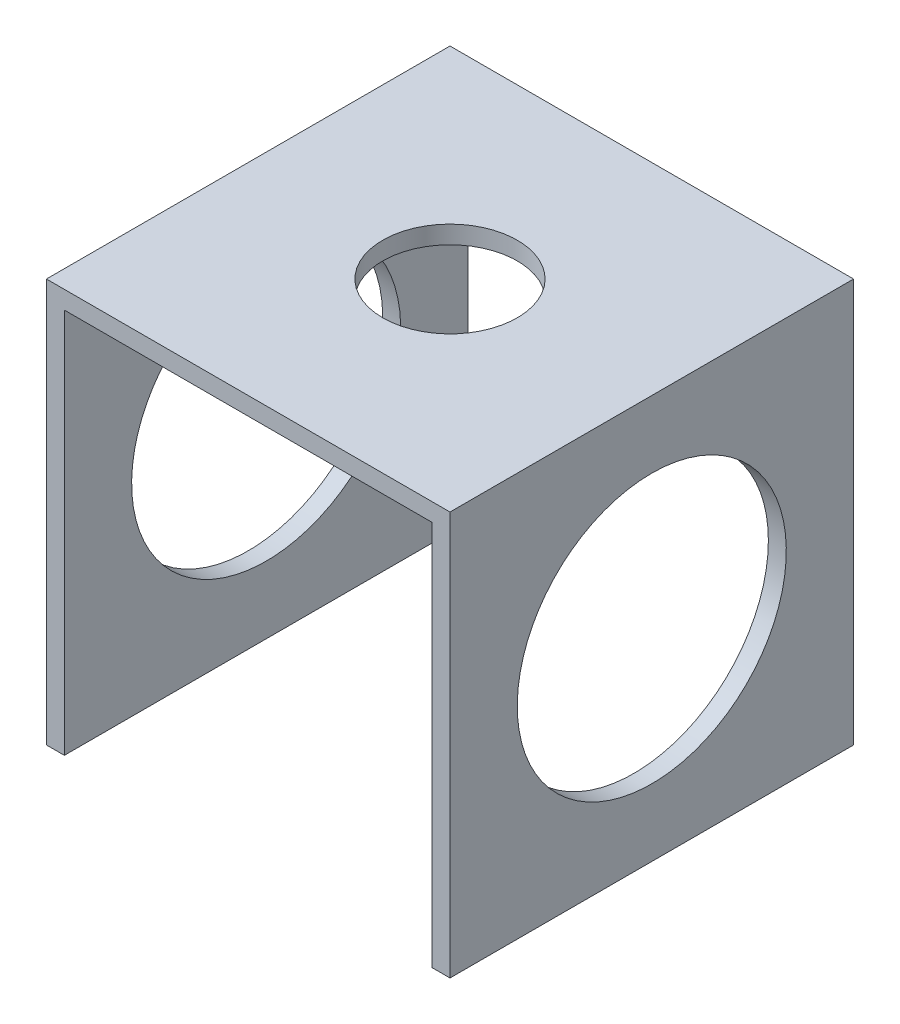
ISO-10303-21;
HEADER;
FILE_DESCRIPTION(('STEP AP214'),'2;1');
FILE_NAME('part.step','',(''),(''),'','','');
FILE_SCHEMA(('AUTOMOTIVE_DESIGN { 1 0 10303 214 1 1 1 1 }'));
ENDSEC;
DATA;
#1=APPLICATION_CONTEXT('core data for automotive mechanical design processes');
#2=APPLICATION_PROTOCOL_DEFINITION('international standard','automotive_design',2000,#1);
#3=PRODUCT_CONTEXT('',#1,'mechanical');
#4=PRODUCT('Part','Part','',(#3));
#5=PRODUCT_RELATED_PRODUCT_CATEGORY('part','',(#4));
#6=PRODUCT_DEFINITION_FORMATION('','',#4);
#7=PRODUCT_DEFINITION_CONTEXT('part definition',#1,'design');
#8=PRODUCT_DEFINITION('design','',#6,#7);
#9=PRODUCT_DEFINITION_SHAPE('','',#8);
#10=(LENGTH_UNIT() NAMED_UNIT(*) SI_UNIT(.MILLI.,.METRE.));
#11=(NAMED_UNIT(*) PLANE_ANGLE_UNIT() SI_UNIT($,.RADIAN.));
#12=(NAMED_UNIT(*) SI_UNIT($,.STERADIAN.) SOLID_ANGLE_UNIT());
#13=UNCERTAINTY_MEASURE_WITH_UNIT(LENGTH_MEASURE(1.E-05),#10,'distance_accuracy_value','');
#14=(GEOMETRIC_REPRESENTATION_CONTEXT(3) GLOBAL_UNCERTAINTY_ASSIGNED_CONTEXT((#13)) GLOBAL_UNIT_ASSIGNED_CONTEXT((#10,
#11,#12)) REPRESENTATION_CONTEXT('',''));
#15=CARTESIAN_POINT('',(0.,0.,0.));
#16=DIRECTION('',(0.,0.,1.));
#17=DIRECTION('',(1.,0.,0.));
#18=AXIS2_PLACEMENT_3D('',#15,#16,#17);
#19=CARTESIAN_POINT('',(90.,180.,180.));
#20=DIRECTION('',(-1.,0.,0.));
#21=DIRECTION('',(0.,-1.,0.));
#22=AXIS2_PLACEMENT_3D('',#19,#20,#21);
#23=PLANE('',#22);
#24=CARTESIAN_POINT('',(90.,90.,90.));
#25=DIRECTION('',(1.,0.,0.));
#26=DIRECTION('',(0.,1.,0.));
#27=AXIS2_PLACEMENT_3D('',#24,#25,#26);
#28=CIRCLE('',#27,60.);
#29=CARTESIAN_POINT('',(90.,150.,90.));
#30=VERTEX_POINT('',#29);
#31=EDGE_CURVE('E216',#30,#30,#28,.T.);
#32=ORIENTED_EDGE('',*,*,#31,.F.);
#33=EDGE_LOOP('',(#32));
#34=FACE_BOUND('',#33,.T.);
#35=DIRECTION('',(0.,1.,0.));
#36=VECTOR('',#35,1.);
#37=CARTESIAN_POINT('',(90.,180.,0.));
#38=LINE('',#37,#36);
#39=CARTESIAN_POINT('',(90.,0.,0.));
#40=VERTEX_POINT('',#39);
#41=CARTESIAN_POINT('',(90.,180.,0.));
#42=VERTEX_POINT('',#41);
#43=EDGE_CURVE('E133',#40,#42,#38,.T.);
#44=ORIENTED_EDGE('',*,*,#43,.T.);
#45=DIRECTION('',(0.,0.,-1.));
#46=VECTOR('',#45,1.);
#47=CARTESIAN_POINT('',(90.,180.,180.));
#48=LINE('',#47,#46);
#49=CARTESIAN_POINT('',(90.,180.,180.));
#50=VERTEX_POINT('',#49);
#51=EDGE_CURVE('E11',#50,#42,#48,.T.);
#52=ORIENTED_EDGE('',*,*,#51,.F.);
#53=DIRECTION('',(0.,1.,0.));
#54=VECTOR('',#53,1.);
#55=CARTESIAN_POINT('',(90.,180.,180.));
#56=LINE('',#55,#54);
#57=CARTESIAN_POINT('',(90.,0.,180.));
#58=VERTEX_POINT('',#57);
#59=EDGE_CURVE('E148',#58,#50,#56,.T.);
#60=ORIENTED_EDGE('',*,*,#59,.F.);
#61=DIRECTION('',(0.,0.,-1.));
#62=VECTOR('',#61,1.);
#63=CARTESIAN_POINT('',(90.,0.,180.));
#64=LINE('',#63,#62);
#65=EDGE_CURVE('E129',#58,#40,#64,.T.);
#66=ORIENTED_EDGE('',*,*,#65,.T.);
#67=EDGE_LOOP('',(#44,#52,#60,#66));
#68=FACE_BOUND('',#67,.T.);
#69=ADVANCED_FACE('F35',(#34,#68),#23,.F.);
#70=CARTESIAN_POINT('',(-90.,180.,180.));
#71=DIRECTION('',(0.,-1.,0.));
#72=DIRECTION('',(0.,0.,-1.));
#73=AXIS2_PLACEMENT_3D('',#70,#71,#72);
#74=PLANE('',#73);
#75=CARTESIAN_POINT('',(0.,180.,90.));
#76=DIRECTION('',(0.,1.,0.));
#77=DIRECTION('',(0.,0.,1.));
#78=AXIS2_PLACEMENT_3D('',#75,#76,#77);
#79=CIRCLE('',#78,30.);
#80=CARTESIAN_POINT('',(0.,180.,120.));
#81=VERTEX_POINT('',#80);
#82=EDGE_CURVE('E160',#81,#81,#79,.T.);
#83=ORIENTED_EDGE('',*,*,#82,.F.);
#84=EDGE_LOOP('',(#83));
#85=FACE_BOUND('',#84,.T.);
#86=DIRECTION('',(-1.,0.,0.));
#87=VECTOR('',#86,1.);
#88=CARTESIAN_POINT('',(-90.,180.,0.));
#89=LINE('',#88,#87);
#90=CARTESIAN_POINT('',(-90.,180.,0.));
#91=VERTEX_POINT('',#90);
#92=EDGE_CURVE('E136',#42,#91,#89,.T.);
#93=ORIENTED_EDGE('',*,*,#92,.T.);
#94=DIRECTION('',(0.,0.,-1.));
#95=VECTOR('',#94,1.);
#96=CARTESIAN_POINT('',(-90.,180.,180.));
#97=LINE('',#96,#95);
#98=CARTESIAN_POINT('',(-90.,180.,180.));
#99=VERTEX_POINT('',#98);
#100=EDGE_CURVE('E44',#99,#91,#97,.T.);
#101=ORIENTED_EDGE('',*,*,#100,.F.);
#102=DIRECTION('',(-1.,0.,0.));
#103=VECTOR('',#102,1.);
#104=CARTESIAN_POINT('',(-90.,180.,180.));
#105=LINE('',#104,#103);
#106=EDGE_CURVE('E96',#50,#99,#105,.T.);
#107=ORIENTED_EDGE('',*,*,#106,.F.);
#108=ORIENTED_EDGE('',*,*,#51,.T.);
#109=EDGE_LOOP('',(#93,#101,#107,#108));
#110=FACE_BOUND('',#109,.T.);
#111=ADVANCED_FACE('F207',(#85,#110),#74,.F.);
#112=CARTESIAN_POINT('',(-90.,180.,180.));
#113=DIRECTION('',(1.,0.,0.));
#114=DIRECTION('',(0.,1.,0.));
#115=AXIS2_PLACEMENT_3D('',#112,#113,#114);
#116=PLANE('',#115);
#117=CARTESIAN_POINT('',(-90.,90.,90.));
#118=DIRECTION('',(1.,0.,0.));
#119=DIRECTION('',(0.,1.,0.));
#120=AXIS2_PLACEMENT_3D('',#117,#118,#119);
#121=CIRCLE('',#120,60.);
#122=CARTESIAN_POINT('',(-90.,150.,90.));
#123=VERTEX_POINT('',#122);
#124=EDGE_CURVE('E164',#123,#123,#121,.T.);
#125=ORIENTED_EDGE('',*,*,#124,.T.);
#126=EDGE_LOOP('',(#125));
#127=FACE_BOUND('',#126,.T.);
#128=DIRECTION('',(0.,-1.,0.));
#129=VECTOR('',#128,1.);
#130=CARTESIAN_POINT('',(-90.,180.,0.));
#131=LINE('',#130,#129);
#132=CARTESIAN_POINT('',(-90.,0.,0.));
#133=VERTEX_POINT('',#132);
#134=EDGE_CURVE('E139',#91,#133,#131,.T.);
#135=ORIENTED_EDGE('',*,*,#134,.T.);
#136=DIRECTION('',(0.,0.,-1.));
#137=VECTOR('',#136,1.);
#138=CARTESIAN_POINT('',(-90.,0.,180.));
#139=LINE('',#138,#137);
#140=CARTESIAN_POINT('',(-90.,0.,180.));
#141=VERTEX_POINT('',#140);
#142=EDGE_CURVE('E155',#141,#133,#139,.T.);
#143=ORIENTED_EDGE('',*,*,#142,.F.);
#144=DIRECTION('',(0.,-1.,0.));
#145=VECTOR('',#144,1.);
#146=CARTESIAN_POINT('',(-90.,180.,180.));
#147=LINE('',#146,#145);
#148=EDGE_CURVE('E175',#99,#141,#147,.T.);
#149=ORIENTED_EDGE('',*,*,#148,.F.);
#150=ORIENTED_EDGE('',*,*,#100,.T.);
#151=EDGE_LOOP('',(#135,#143,#149,#150));
#152=FACE_BOUND('',#151,.T.);
#153=ADVANCED_FACE('F212',(#127,#152),#116,.F.);
#154=CARTESIAN_POINT('',(-90.,0.,180.));
#155=DIRECTION('',(0.,1.,0.));
#156=DIRECTION('',(-1.,0.,0.));
#157=AXIS2_PLACEMENT_3D('',#154,#155,#156);
#158=PLANE('',#157);
#159=DIRECTION('',(1.,0.,0.));
#160=VECTOR('',#159,1.);
#161=CARTESIAN_POINT('',(-90.,0.,0.));
#162=LINE('',#161,#160);
#163=CARTESIAN_POINT('',(-82.,0.,0.));
#164=VERTEX_POINT('',#163);
#165=EDGE_CURVE('E141',#133,#164,#162,.T.);
#166=ORIENTED_EDGE('',*,*,#165,.T.);
#167=DIRECTION('',(0.,0.,-1.));
#168=VECTOR('',#167,1.);
#169=CARTESIAN_POINT('',(-82.,0.,180.));
#170=LINE('',#169,#168);
#171=CARTESIAN_POINT('',(-82.,0.,180.));
#172=VERTEX_POINT('',#171);
#173=EDGE_CURVE('E152',#172,#164,#170,.T.);
#174=ORIENTED_EDGE('',*,*,#173,.F.);
#175=DIRECTION('',(1.,0.,0.));
#176=VECTOR('',#175,1.);
#177=CARTESIAN_POINT('',(-90.,0.,180.));
#178=LINE('',#177,#176);
#179=EDGE_CURVE('E177',#141,#172,#178,.T.);
#180=ORIENTED_EDGE('',*,*,#179,.F.);
#181=ORIENTED_EDGE('',*,*,#142,.T.);
#182=EDGE_LOOP('',(#166,#174,#180,#181));
#183=FACE_BOUND('',#182,.T.);
#184=ADVANCED_FACE('F183',(#183),#158,.F.);
#185=CARTESIAN_POINT('',(-82.,0.,180.));
#186=DIRECTION('',(-1.,0.,0.));
#187=DIRECTION('',(0.,0.,1.));
#188=AXIS2_PLACEMENT_3D('',#185,#186,#187);
#189=PLANE('',#188);
#190=CARTESIAN_POINT('',(-82.,90.,90.));
#191=DIRECTION('',(-1.,0.,0.));
#192=DIRECTION('',(0.,0.,1.));
#193=AXIS2_PLACEMENT_3D('',#190,#191,#192);
#194=CIRCLE('',#193,60.);
#195=CARTESIAN_POINT('',(-82.,150.,90.));
#196=VERTEX_POINT('',#195);
#197=EDGE_CURVE('E169',#196,#196,#194,.T.);
#198=ORIENTED_EDGE('',*,*,#197,.T.);
#199=EDGE_LOOP('',(#198));
#200=FACE_BOUND('',#199,.T.);
#201=DIRECTION('',(0.,1.,0.));
#202=VECTOR('',#201,1.);
#203=CARTESIAN_POINT('',(-82.,0.,0.));
#204=LINE('',#203,#202);
#205=CARTESIAN_POINT('',(-82.,172.,0.));
#206=VERTEX_POINT('',#205);
#207=EDGE_CURVE('E143',#164,#206,#204,.T.);
#208=ORIENTED_EDGE('',*,*,#207,.T.);
#209=DIRECTION('',(0.,0.,-1.));
#210=VECTOR('',#209,1.);
#211=CARTESIAN_POINT('',(-82.,172.,180.));
#212=LINE('',#211,#210);
#213=CARTESIAN_POINT('',(-82.,172.,180.));
#214=VERTEX_POINT('',#213);
#215=EDGE_CURVE('E124',#214,#206,#212,.T.);
#216=ORIENTED_EDGE('',*,*,#215,.F.);
#217=DIRECTION('',(0.,1.,0.));
#218=VECTOR('',#217,1.);
#219=CARTESIAN_POINT('',(-82.,0.,180.));
#220=LINE('',#219,#218);
#221=EDGE_CURVE('E115',#172,#214,#220,.T.);
#222=ORIENTED_EDGE('',*,*,#221,.F.);
#223=ORIENTED_EDGE('',*,*,#173,.T.);
#224=EDGE_LOOP('',(#208,#216,#222,#223));
#225=FACE_BOUND('',#224,.T.);
#226=ADVANCED_FACE('F187',(#200,#225),#189,.F.);
#227=CARTESIAN_POINT('',(82.,172.,180.));
#228=DIRECTION('',(0.,1.,0.));
#229=DIRECTION('',(0.,0.,1.));
#230=AXIS2_PLACEMENT_3D('',#227,#228,#229);
#231=PLANE('',#230);
#232=CARTESIAN_POINT('',(0.,172.,90.));
#233=DIRECTION('',(0.,1.,0.));
#234=DIRECTION('',(0.,0.,1.));
#235=AXIS2_PLACEMENT_3D('',#232,#233,#234);
#236=CIRCLE('',#235,30.);
#237=CARTESIAN_POINT('',(0.,172.,120.));
#238=VERTEX_POINT('',#237);
#239=EDGE_CURVE('E137',#238,#238,#236,.T.);
#240=ORIENTED_EDGE('',*,*,#239,.T.);
#241=EDGE_LOOP('',(#240));
#242=FACE_BOUND('',#241,.T.);
#243=DIRECTION('',(1.,0.,0.));
#244=VECTOR('',#243,1.);
#245=CARTESIAN_POINT('',(82.,172.,0.));
#246=LINE('',#245,#244);
#247=CARTESIAN_POINT('',(82.,172.,0.));
#248=VERTEX_POINT('',#247);
#249=EDGE_CURVE('E123',#206,#248,#246,.T.);
#250=ORIENTED_EDGE('',*,*,#249,.T.);
#251=DIRECTION('',(0.,0.,-1.));
#252=VECTOR('',#251,1.);
#253=CARTESIAN_POINT('',(82.,172.,180.));
#254=LINE('',#253,#252);
#255=CARTESIAN_POINT('',(82.,172.,180.));
#256=VERTEX_POINT('',#255);
#257=EDGE_CURVE('E120',#256,#248,#254,.T.);
#258=ORIENTED_EDGE('',*,*,#257,.F.);
#259=DIRECTION('',(1.,0.,0.));
#260=VECTOR('',#259,1.);
#261=CARTESIAN_POINT('',(82.,172.,180.));
#262=LINE('',#261,#260);
#263=EDGE_CURVE('E109',#214,#256,#262,.T.);
#264=ORIENTED_EDGE('',*,*,#263,.F.);
#265=ORIENTED_EDGE('',*,*,#215,.T.);
#266=EDGE_LOOP('',(#250,#258,#264,#265));
#267=FACE_BOUND('',#266,.T.);
#268=ADVANCED_FACE('F121',(#242,#267),#231,.F.);
#269=CARTESIAN_POINT('',(82.,0.,180.));
#270=DIRECTION('',(1.,0.,0.));
#271=DIRECTION('',(0.,0.,-1.));
#272=AXIS2_PLACEMENT_3D('',#269,#270,#271);
#273=PLANE('',#272);
#274=CARTESIAN_POINT('',(82.,90.,90.));
#275=DIRECTION('',(1.,0.,0.));
#276=DIRECTION('',(0.,0.,-1.));
#277=AXIS2_PLACEMENT_3D('',#274,#275,#276);
#278=CIRCLE('',#277,60.);
#279=CARTESIAN_POINT('',(82.,90.,30.));
#280=VERTEX_POINT('',#279);
#281=EDGE_CURVE('E38',#280,#280,#278,.T.);
#282=ORIENTED_EDGE('',*,*,#281,.T.);
#283=EDGE_LOOP('',(#282));
#284=FACE_BOUND('',#283,.T.);
#285=DIRECTION('',(0.,-1.,0.));
#286=VECTOR('',#285,1.);
#287=CARTESIAN_POINT('',(82.,0.,0.));
#288=LINE('',#287,#286);
#289=CARTESIAN_POINT('',(82.,0.,0.));
#290=VERTEX_POINT('',#289);
#291=EDGE_CURVE('E82',#248,#290,#288,.T.);
#292=ORIENTED_EDGE('',*,*,#291,.T.);
#293=DIRECTION('',(0.,0.,-1.));
#294=VECTOR('',#293,1.);
#295=CARTESIAN_POINT('',(82.,0.,180.));
#296=LINE('',#295,#294);
#297=CARTESIAN_POINT('',(82.,0.,180.));
#298=VERTEX_POINT('',#297);
#299=EDGE_CURVE('E125',#298,#290,#296,.T.);
#300=ORIENTED_EDGE('',*,*,#299,.F.);
#301=DIRECTION('',(0.,-1.,0.));
#302=VECTOR('',#301,1.);
#303=CARTESIAN_POINT('',(82.,0.,180.));
#304=LINE('',#303,#302);
#305=EDGE_CURVE('E113',#256,#298,#304,.T.);
#306=ORIENTED_EDGE('',*,*,#305,.F.);
#307=ORIENTED_EDGE('',*,*,#257,.T.);
#308=EDGE_LOOP('',(#292,#300,#306,#307));
#309=FACE_BOUND('',#308,.T.);
#310=ADVANCED_FACE('F127',(#284,#309),#273,.F.);
#311=CARTESIAN_POINT('',(90.,0.,180.));
#312=DIRECTION('',(0.,1.,0.));
#313=DIRECTION('',(-1.,0.,0.));
#314=AXIS2_PLACEMENT_3D('',#311,#312,#313);
#315=PLANE('',#314);
#316=DIRECTION('',(1.,0.,0.));
#317=VECTOR('',#316,1.);
#318=CARTESIAN_POINT('',(90.,0.,0.));
#319=LINE('',#318,#317);
#320=EDGE_CURVE('E88',#290,#40,#319,.T.);
#321=ORIENTED_EDGE('',*,*,#320,.T.);
#322=ORIENTED_EDGE('',*,*,#65,.F.);
#323=DIRECTION('',(1.,0.,0.));
#324=VECTOR('',#323,1.);
#325=CARTESIAN_POINT('',(90.,0.,180.));
#326=LINE('',#325,#324);
#327=EDGE_CURVE('E53',#298,#58,#326,.T.);
#328=ORIENTED_EDGE('',*,*,#327,.F.);
#329=ORIENTED_EDGE('',*,*,#299,.T.);
#330=EDGE_LOOP('',(#321,#322,#328,#329));
#331=FACE_BOUND('',#330,.T.);
#332=ADVANCED_FACE('F195',(#331),#315,.F.);
#333=CARTESIAN_POINT('',(0.,0.,180.));
#334=DIRECTION('',(0.,0.,-1.));
#335=DIRECTION('',(-1.,0.,0.));
#336=AXIS2_PLACEMENT_3D('',#333,#334,#335);
#337=PLANE('',#336);
#338=ORIENTED_EDGE('',*,*,#59,.T.);
#339=ORIENTED_EDGE('',*,*,#106,.T.);
#340=ORIENTED_EDGE('',*,*,#148,.T.);
#341=ORIENTED_EDGE('',*,*,#179,.T.);
#342=ORIENTED_EDGE('',*,*,#221,.T.);
#343=ORIENTED_EDGE('',*,*,#263,.T.);
#344=ORIENTED_EDGE('',*,*,#305,.T.);
#345=ORIENTED_EDGE('',*,*,#327,.T.);
#346=EDGE_LOOP('',(#338,#339,#340,#341,#342,#343,#344,#345));
#347=FACE_BOUND('',#346,.T.);
#348=ADVANCED_FACE('F111',(#347),#337,.F.);
#349=CARTESIAN_POINT('',(0.,0.,0.));
#350=DIRECTION('',(0.,0.,-1.));
#351=DIRECTION('',(-1.,0.,0.));
#352=AXIS2_PLACEMENT_3D('',#349,#350,#351);
#353=PLANE('',#352);
#354=ORIENTED_EDGE('',*,*,#43,.F.);
#355=ORIENTED_EDGE('',*,*,#320,.F.);
#356=ORIENTED_EDGE('',*,*,#291,.F.);
#357=ORIENTED_EDGE('',*,*,#249,.F.);
#358=ORIENTED_EDGE('',*,*,#207,.F.);
#359=ORIENTED_EDGE('',*,*,#165,.F.);
#360=ORIENTED_EDGE('',*,*,#134,.F.);
#361=ORIENTED_EDGE('',*,*,#92,.F.);
#362=EDGE_LOOP('',(#354,#355,#356,#357,#358,#359,#360,#361));
#363=FACE_BOUND('',#362,.T.);
#364=ADVANCED_FACE('F190',(#363),#353,.T.);
#365=CARTESIAN_POINT('',(0.,0.,90.));
#366=DIRECTION('',(0.,1.,0.));
#367=DIRECTION('',(0.,0.,1.));
#368=AXIS2_PLACEMENT_3D('',#365,#366,#367);
#369=CYLINDRICAL_SURFACE('',#368,30.);
#370=CARTESIAN_POINT('',(0.,180.,120.));
#371=CARTESIAN_POINT('',(0.,179.916666666667,120.));
#372=CARTESIAN_POINT('',(0.,179.833333333333,120.));
#373=CARTESIAN_POINT('',(0.,179.666666666667,120.));
#374=CARTESIAN_POINT('',(0.,179.583333333333,120.));
#375=CARTESIAN_POINT('',(0.,179.416666666667,120.));
#376=CARTESIAN_POINT('',(0.,179.333333333333,120.));
#377=CARTESIAN_POINT('',(0.,179.166666666667,120.));
#378=CARTESIAN_POINT('',(0.,179.083333333333,120.));
#379=CARTESIAN_POINT('',(0.,178.916666666667,120.));
#380=CARTESIAN_POINT('',(0.,178.833333333333,120.));
#381=CARTESIAN_POINT('',(0.,178.666666666667,120.));
#382=CARTESIAN_POINT('',(0.,178.583333333333,120.));
#383=CARTESIAN_POINT('',(0.,178.416666666667,120.));
#384=CARTESIAN_POINT('',(0.,178.333333333333,120.));
#385=CARTESIAN_POINT('',(0.,178.166666666667,120.));
#386=CARTESIAN_POINT('',(0.,178.083333333333,120.));
#387=CARTESIAN_POINT('',(0.,177.916666666667,120.));
#388=CARTESIAN_POINT('',(0.,177.833333333333,120.));
#389=CARTESIAN_POINT('',(0.,177.666666666667,120.));
#390=CARTESIAN_POINT('',(0.,177.583333333333,120.));
#391=CARTESIAN_POINT('',(0.,177.416666666667,120.));
#392=CARTESIAN_POINT('',(0.,177.333333333333,120.));
#393=CARTESIAN_POINT('',(0.,177.166666666667,120.));
#394=CARTESIAN_POINT('',(0.,177.083333333333,120.));
#395=CARTESIAN_POINT('',(0.,176.916666666667,120.));
#396=CARTESIAN_POINT('',(0.,176.833333333333,120.));
#397=CARTESIAN_POINT('',(0.,176.666666666667,120.));
#398=CARTESIAN_POINT('',(0.,176.583333333333,120.));
#399=CARTESIAN_POINT('',(0.,176.416666666667,120.));
#400=CARTESIAN_POINT('',(0.,176.333333333333,120.));
#401=CARTESIAN_POINT('',(0.,176.166666666667,120.));
#402=CARTESIAN_POINT('',(0.,176.083333333333,120.));
#403=CARTESIAN_POINT('',(0.,175.916666666667,120.));
#404=CARTESIAN_POINT('',(0.,175.833333333333,120.));
#405=CARTESIAN_POINT('',(0.,175.666666666667,120.));
#406=CARTESIAN_POINT('',(0.,175.583333333333,120.));
#407=CARTESIAN_POINT('',(0.,175.416666666667,120.));
#408=CARTESIAN_POINT('',(0.,175.333333333333,120.));
#409=CARTESIAN_POINT('',(0.,175.166666666667,120.));
#410=CARTESIAN_POINT('',(0.,175.083333333333,120.));
#411=CARTESIAN_POINT('',(0.,174.916666666667,120.));
#412=CARTESIAN_POINT('',(0.,174.833333333333,120.));
#413=CARTESIAN_POINT('',(0.,174.666666666667,120.));
#414=CARTESIAN_POINT('',(0.,174.583333333333,120.));
#415=CARTESIAN_POINT('',(0.,174.416666666667,120.));
#416=CARTESIAN_POINT('',(0.,174.333333333333,120.));
#417=CARTESIAN_POINT('',(0.,174.166666666667,120.));
#418=CARTESIAN_POINT('',(0.,174.083333333333,120.));
#419=CARTESIAN_POINT('',(0.,173.916666666667,120.));
#420=CARTESIAN_POINT('',(0.,173.833333333333,120.));
#421=CARTESIAN_POINT('',(0.,173.666666666667,120.));
#422=CARTESIAN_POINT('',(0.,173.583333333333,120.));
#423=CARTESIAN_POINT('',(0.,173.416666666667,120.));
#424=CARTESIAN_POINT('',(0.,173.333333333333,120.));
#425=CARTESIAN_POINT('',(0.,173.166666666667,120.));
#426=CARTESIAN_POINT('',(0.,173.083333333333,120.));
#427=CARTESIAN_POINT('',(0.,172.916666666667,120.));
#428=CARTESIAN_POINT('',(0.,172.833333333333,120.));
#429=CARTESIAN_POINT('',(0.,172.666666666667,120.));
#430=CARTESIAN_POINT('',(0.,172.583333333333,120.));
#431=CARTESIAN_POINT('',(0.,172.416666666667,120.));
#432=CARTESIAN_POINT('',(0.,172.333333333333,120.));
#433=CARTESIAN_POINT('',(0.,172.166666666667,120.));
#434=CARTESIAN_POINT('',(0.,172.083333333333,120.));
#435=CARTESIAN_POINT('',(0.,172.,120.));
#436=B_SPLINE_CURVE_WITH_KNOTS('',3,(#370,#371,#372,#373,#374,#375,#376,#377,#378,#379,#380,
#381,#382,#383,#384,#385,#386,#387,#388,#389,#390,#391,#392,#393,#394,#395,#396,#397,#398,#399,
#400,#401,#402,#403,#404,#405,#406,#407,#408,#409,#410,#411,#412,#413,#414,#415,#416,#417,#418,
#419,#420,#421,#422,#423,#424,#425,#426,#427,#428,#429,#430,#431,#432,#433,#434,#435),
.UNSPECIFIED.,.F.,.F.,(4,2,2,2,2,2,2,2,2,2,2,2,2,2,2,2,2,2,2,2,2,2,2,2,2,2,2,2,2,2,2,2,4),(0.,
0.25,0.5,0.750000000000001,1.,1.25,1.5,1.75,2.,2.25,2.5,2.75,3.,3.25,3.5,3.75,4.,4.25,4.5,4.75,
5.,5.25,5.50000000000001,5.75000000000001,6.00000000000001,6.25000000000001,6.50000000000001,
6.75000000000001,7.00000000000001,7.25000000000001,7.50000000000001,7.75000000000001,
8.00000000000001),.UNSPECIFIED.);
#437=EDGE_CURVE('BSEAM264',#81,#238,#436,.T.);
#438=ORIENTED_EDGE('',*,*,#82,.T.);
#439=ORIENTED_EDGE('',*,*,#239,.F.);
#440=ORIENTED_EDGE('',*,*,#437,.T.);
#441=ORIENTED_EDGE('',*,*,#437,.F.);
#442=EDGE_LOOP('',(#438,#440,#439,#441));
#443=FACE_BOUND('',#442,.T.);
#444=ADVANCED_FACE('F264',(#443),#369,.F.);
#445=CARTESIAN_POINT('',(-127.,90.,90.));
#446=DIRECTION('',(1.,0.,0.));
#447=DIRECTION('',(0.,1.,0.));
#448=AXIS2_PLACEMENT_3D('',#445,#446,#447);
#449=CYLINDRICAL_SURFACE('',#448,60.);
#450=ORIENTED_EDGE('',*,*,#31,.T.);
#451=EDGE_LOOP('',(#450));
#452=FACE_BOUND('',#451,.T.);
#453=ORIENTED_EDGE('',*,*,#281,.F.);
#454=EDGE_LOOP('',(#453));
#455=FACE_BOUND('',#454,.T.);
#456=ADVANCED_FACE('F227',(#452,#455),#449,.F.);
#457=CARTESIAN_POINT('',(-82.,150.,90.));
#458=CARTESIAN_POINT('',(-82.0833333333333,150.,90.));
#459=CARTESIAN_POINT('',(-82.1666666666666,150.,90.));
#460=CARTESIAN_POINT('',(-82.3333333333333,150.,90.));
#461=CARTESIAN_POINT('',(-82.4166666666666,150.,90.));
#462=CARTESIAN_POINT('',(-82.5833333333333,150.,90.));
#463=CARTESIAN_POINT('',(-82.6666666666666,150.,90.));
#464=CARTESIAN_POINT('',(-82.8333333333333,150.,90.));
#465=CARTESIAN_POINT('',(-82.9166666666666,150.,90.));
#466=CARTESIAN_POINT('',(-83.0833333333333,150.,90.));
#467=CARTESIAN_POINT('',(-83.1666666666666,150.,90.));
#468=CARTESIAN_POINT('',(-83.3333333333333,150.,90.));
#469=CARTESIAN_POINT('',(-83.4166666666666,150.,90.));
#470=CARTESIAN_POINT('',(-83.5833333333333,150.,90.));
#471=CARTESIAN_POINT('',(-83.6666666666666,150.,90.));
#472=CARTESIAN_POINT('',(-83.8333333333333,150.,90.));
#473=CARTESIAN_POINT('',(-83.9166666666666,150.,90.));
#474=CARTESIAN_POINT('',(-84.0833333333333,150.,90.));
#475=CARTESIAN_POINT('',(-84.1666666666666,150.,90.));
#476=CARTESIAN_POINT('',(-84.3333333333333,150.,90.));
#477=CARTESIAN_POINT('',(-84.4166666666666,150.,90.));
#478=CARTESIAN_POINT('',(-84.5833333333333,150.,90.));
#479=CARTESIAN_POINT('',(-84.6666666666666,150.,90.));
#480=CARTESIAN_POINT('',(-84.8333333333333,150.,90.));
#481=CARTESIAN_POINT('',(-84.9166666666666,150.,90.));
#482=CARTESIAN_POINT('',(-85.0833333333333,150.,90.));
#483=CARTESIAN_POINT('',(-85.1666666666666,150.,90.));
#484=CARTESIAN_POINT('',(-85.3333333333333,150.,90.));
#485=CARTESIAN_POINT('',(-85.4166666666666,150.,90.));
#486=CARTESIAN_POINT('',(-85.5833333333333,150.,90.));
#487=CARTESIAN_POINT('',(-85.6666666666666,150.,90.));
#488=CARTESIAN_POINT('',(-85.8333333333333,150.,90.));
#489=CARTESIAN_POINT('',(-85.9166666666666,150.,90.));
#490=CARTESIAN_POINT('',(-86.0833333333333,150.,90.));
#491=CARTESIAN_POINT('',(-86.1666666666666,150.,90.));
#492=CARTESIAN_POINT('',(-86.3333333333333,150.,90.));
#493=CARTESIAN_POINT('',(-86.4166666666666,150.,90.));
#494=CARTESIAN_POINT('',(-86.5833333333333,150.,90.));
#495=CARTESIAN_POINT('',(-86.6666666666666,150.,90.));
#496=CARTESIAN_POINT('',(-86.8333333333333,150.,90.));
#497=CARTESIAN_POINT('',(-86.9166666666666,150.,90.));
#498=CARTESIAN_POINT('',(-87.0833333333333,150.,90.));
#499=CARTESIAN_POINT('',(-87.1666666666666,150.,90.));
#500=CARTESIAN_POINT('',(-87.3333333333333,150.,90.));
#501=CARTESIAN_POINT('',(-87.4166666666666,150.,90.));
#502=CARTESIAN_POINT('',(-87.5833333333333,150.,90.));
#503=CARTESIAN_POINT('',(-87.6666666666666,150.,90.));
#504=CARTESIAN_POINT('',(-87.8333333333333,150.,90.));
#505=CARTESIAN_POINT('',(-87.9166666666666,150.,90.));
#506=CARTESIAN_POINT('',(-88.0833333333333,150.,90.));
#507=CARTESIAN_POINT('',(-88.1666666666666,150.,90.));
#508=CARTESIAN_POINT('',(-88.3333333333333,150.,90.));
#509=CARTESIAN_POINT('',(-88.4166666666666,150.,90.));
#510=CARTESIAN_POINT('',(-88.5833333333333,150.,90.));
#511=CARTESIAN_POINT('',(-88.6666666666666,150.,90.));
#512=CARTESIAN_POINT('',(-88.8333333333333,150.,90.));
#513=CARTESIAN_POINT('',(-88.9166666666666,150.,90.));
#514=CARTESIAN_POINT('',(-89.0833333333333,150.,90.));
#515=CARTESIAN_POINT('',(-89.1666666666666,150.,90.));
#516=CARTESIAN_POINT('',(-89.3333333333333,150.,90.));
#517=CARTESIAN_POINT('',(-89.4166666666666,150.,90.));
#518=CARTESIAN_POINT('',(-89.5833333333333,150.,90.));
#519=CARTESIAN_POINT('',(-89.6666666666666,150.,90.));
#520=CARTESIAN_POINT('',(-89.8333333333333,150.,90.));
#521=CARTESIAN_POINT('',(-89.9166666666666,150.,90.));
#522=CARTESIAN_POINT('',(-90.,150.,90.));
#523=B_SPLINE_CURVE_WITH_KNOTS('',3,(#457,#458,#459,#460,#461,#462,#463,#464,#465,#466,#467,
#468,#469,#470,#471,#472,#473,#474,#475,#476,#477,#478,#479,#480,#481,#482,#483,#484,#485,#486,
#487,#488,#489,#490,#491,#492,#493,#494,#495,#496,#497,#498,#499,#500,#501,#502,#503,#504,#505,
#506,#507,#508,#509,#510,#511,#512,#513,#514,#515,#516,#517,#518,#519,#520,#521,#522),
.UNSPECIFIED.,.F.,.F.,(4,2,2,2,2,2,2,2,2,2,2,2,2,2,2,2,2,2,2,2,2,2,2,2,2,2,2,2,2,2,2,2,4),(0.,
0.25,0.5,0.750000000000001,1.,1.25,1.5,1.75,2.,2.25,2.5,2.75,3.,3.25,3.5,3.75,4.,4.25,4.5,4.75,
5.,5.25,5.50000000000001,5.75000000000001,6.00000000000001,6.25000000000001,6.50000000000001,
6.75000000000001,7.00000000000001,7.25000000000001,7.50000000000001,7.75000000000001,
8.00000000000001),.UNSPECIFIED.);
#524=EDGE_CURVE('BSEAM224',#196,#123,#523,.T.);
#525=ORIENTED_EDGE('',*,*,#197,.F.);
#526=ORIENTED_EDGE('',*,*,#124,.F.);
#527=ORIENTED_EDGE('',*,*,#524,.T.);
#528=ORIENTED_EDGE('',*,*,#524,.F.);
#529=EDGE_LOOP('',(#525,#527,#526,#528));
#530=FACE_BOUND('',#529,.T.);
#531=ADVANCED_FACE('F224',(#530),#449,.F.);
#532=CLOSED_SHELL('',(#69,#111,#153,#184,#226,#268,#310,#332,#348,#364,#444,#456,#531));
#533=MANIFOLD_SOLID_BREP('B2',#532);
#534=ADVANCED_BREP_SHAPE_REPRESENTATION('',(#18,#533),#14);
#535=SHAPE_DEFINITION_REPRESENTATION(#9,#534);
ENDSEC;
END-ISO-10303-21;
